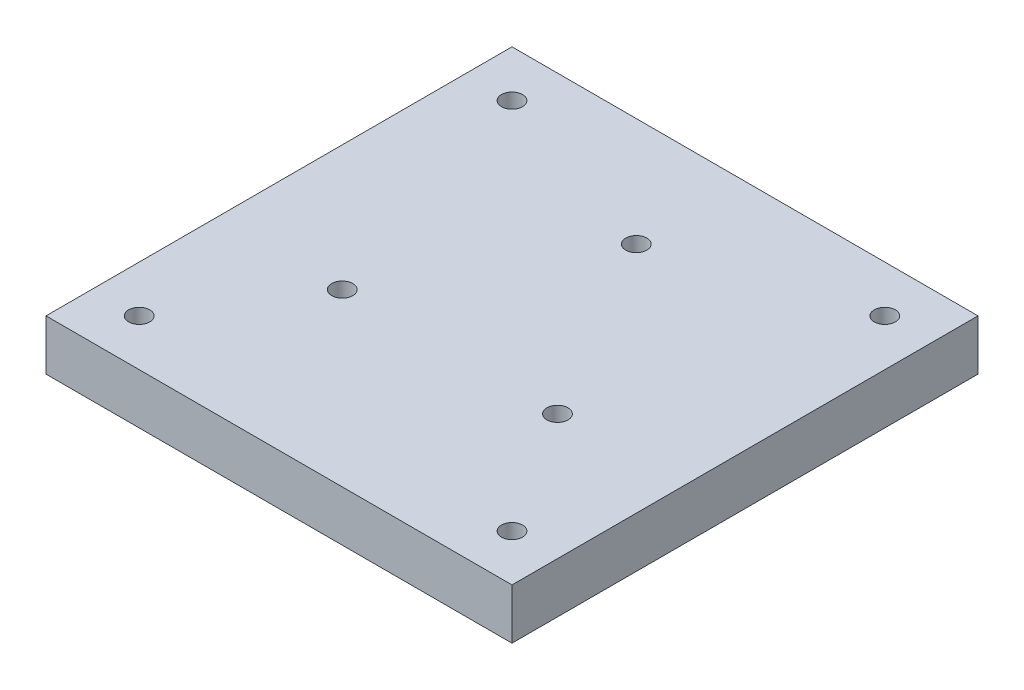
ISO-10303-21;
HEADER;
FILE_DESCRIPTION(('STEP AP214'),'2;1');
FILE_NAME('part.step','',(''),(''),'','','');
FILE_SCHEMA(('AUTOMOTIVE_DESIGN { 1 0 10303 214 1 1 1 1 }'));
ENDSEC;
DATA;
#1=APPLICATION_CONTEXT('core data for automotive mechanical design processes');
#2=APPLICATION_PROTOCOL_DEFINITION('international standard','automotive_design',2000,#1);
#3=PRODUCT_CONTEXT('',#1,'mechanical');
#4=PRODUCT('Part','Part','',(#3));
#5=PRODUCT_RELATED_PRODUCT_CATEGORY('part','',(#4));
#6=PRODUCT_DEFINITION_FORMATION('','',#4);
#7=PRODUCT_DEFINITION_CONTEXT('part definition',#1,'design');
#8=PRODUCT_DEFINITION('design','',#6,#7);
#9=PRODUCT_DEFINITION_SHAPE('','',#8);
#10=(LENGTH_UNIT() NAMED_UNIT(*) SI_UNIT(.MILLI.,.METRE.));
#11=(NAMED_UNIT(*) PLANE_ANGLE_UNIT() SI_UNIT($,.RADIAN.));
#12=(NAMED_UNIT(*) SI_UNIT($,.STERADIAN.) SOLID_ANGLE_UNIT());
#13=UNCERTAINTY_MEASURE_WITH_UNIT(LENGTH_MEASURE(1.E-05),#10,'distance_accuracy_value','');
#14=(GEOMETRIC_REPRESENTATION_CONTEXT(3) GLOBAL_UNCERTAINTY_ASSIGNED_CONTEXT((#13)) GLOBAL_UNIT_ASSIGNED_CONTEXT((#10,
#11,#12)) REPRESENTATION_CONTEXT('',''));
#15=CARTESIAN_POINT('',(0.,0.,0.));
#16=DIRECTION('',(0.,0.,1.));
#17=DIRECTION('',(1.,0.,0.));
#18=AXIS2_PLACEMENT_3D('',#15,#16,#17);
#19=CARTESIAN_POINT('',(0.,5.159375,0.));
#20=DIRECTION('',(0.,1.,0.));
#21=DIRECTION('',(0.,0.,1.));
#22=AXIS2_PLACEMENT_3D('',#19,#20,#21);
#23=PLANE('',#22);
#24=CARTESIAN_POINT('',(-38.1,5.159375,-38.1));
#25=DIRECTION('',(0.,-1.,0.));
#26=DIRECTION('',(0.,0.,-1.));
#27=AXIS2_PLACEMENT_3D('',#24,#25,#26);
#28=CIRCLE('',#27,2.15265);
#29=CARTESIAN_POINT('',(-38.1,5.159375,-40.25265));
#30=VERTEX_POINT('',#29);
#31=EDGE_CURVE('E245',#30,#30,#28,.T.);
#32=ORIENTED_EDGE('',*,*,#31,.T.);
#33=EDGE_LOOP('',(#32));
#34=FACE_BOUND('',#33,.T.);
#35=CARTESIAN_POINT('',(38.1,5.159375,38.1));
#36=DIRECTION('',(0.,-1.,0.));
#37=DIRECTION('',(0.,0.,-1.));
#38=AXIS2_PLACEMENT_3D('',#35,#36,#37);
#39=CIRCLE('',#38,2.15265);
#40=CARTESIAN_POINT('',(38.1,5.159375,35.94735));
#41=VERTEX_POINT('',#40);
#42=EDGE_CURVE('E231',#41,#41,#39,.T.);
#43=ORIENTED_EDGE('',*,*,#42,.T.);
#44=EDGE_LOOP('',(#43));
#45=FACE_BOUND('',#44,.T.);
#46=CARTESIAN_POINT('',(38.1,5.159375,-38.1));
#47=DIRECTION('',(0.,-1.,0.));
#48=DIRECTION('',(0.,0.,-1.));
#49=AXIS2_PLACEMENT_3D('',#46,#47,#48);
#50=CIRCLE('',#49,2.15265);
#51=CARTESIAN_POINT('',(38.1,5.159375,-40.25265));
#52=VERTEX_POINT('',#51);
#53=EDGE_CURVE('E214',#52,#52,#50,.T.);
#54=ORIENTED_EDGE('',*,*,#53,.T.);
#55=EDGE_LOOP('',(#54));
#56=FACE_BOUND('',#55,.T.);
#57=CARTESIAN_POINT('',(-38.1,5.159375,38.1));
#58=DIRECTION('',(0.,-1.,0.));
#59=DIRECTION('',(0.,0.,-1.));
#60=AXIS2_PLACEMENT_3D('',#57,#58,#59);
#61=CIRCLE('',#60,2.15265);
#62=CARTESIAN_POINT('',(-38.1,5.159375,35.94735));
#63=VERTEX_POINT('',#62);
#64=EDGE_CURVE('E188',#63,#63,#61,.T.);
#65=ORIENTED_EDGE('',*,*,#64,.T.);
#66=EDGE_LOOP('',(#65));
#67=FACE_BOUND('',#66,.T.);
#68=CARTESIAN_POINT('',(-21.9970452561247,5.159375,12.7000000000001));
#69=DIRECTION('',(0.,-1.,0.));
#70=DIRECTION('',(0.,0.,-1.));
#71=AXIS2_PLACEMENT_3D('',#68,#69,#70);
#72=CIRCLE('',#71,2.15265);
#73=CARTESIAN_POINT('',(-21.9970452561247,5.159375,10.5473500000001));
#74=VERTEX_POINT('',#73);
#75=EDGE_CURVE('E172',#74,#74,#72,.T.);
#76=ORIENTED_EDGE('',*,*,#75,.T.);
#77=EDGE_LOOP('',(#76));
#78=FACE_BOUND('',#77,.T.);
#79=CARTESIAN_POINT('',(21.9970452561249,5.159375,12.6999999999998));
#80=DIRECTION('',(0.,-1.,0.));
#81=DIRECTION('',(0.,0.,-1.));
#82=AXIS2_PLACEMENT_3D('',#79,#80,#81);
#83=CIRCLE('',#82,2.15265);
#84=CARTESIAN_POINT('',(21.9970452561249,5.159375,10.5473499999998));
#85=VERTEX_POINT('',#84);
#86=EDGE_CURVE('E156',#85,#85,#83,.T.);
#87=ORIENTED_EDGE('',*,*,#86,.T.);
#88=EDGE_LOOP('',(#87));
#89=FACE_BOUND('',#88,.T.);
#90=CARTESIAN_POINT('',(0.,5.159375,-25.4));
#91=DIRECTION('',(0.,-1.,0.));
#92=DIRECTION('',(0.,0.,-1.));
#93=AXIS2_PLACEMENT_3D('',#90,#91,#92);
#94=CIRCLE('',#93,2.15265);
#95=CARTESIAN_POINT('',(0.,5.159375,-27.55265));
#96=VERTEX_POINT('',#95);
#97=EDGE_CURVE('E123',#96,#96,#94,.T.);
#98=ORIENTED_EDGE('',*,*,#97,.T.);
#99=EDGE_LOOP('',(#98));
#100=FACE_BOUND('',#99,.T.);
#101=DIRECTION('',(1.,0.,0.));
#102=VECTOR('',#101,1.);
#103=CARTESIAN_POINT('',(-47.625,5.159375,47.625));
#104=LINE('',#103,#102);
#105=CARTESIAN_POINT('',(-47.625,5.159375,47.625));
#106=VERTEX_POINT('',#105);
#107=CARTESIAN_POINT('',(47.625,5.159375,47.625));
#108=VERTEX_POINT('',#107);
#109=EDGE_CURVE('E99',#106,#108,#104,.T.);
#110=ORIENTED_EDGE('',*,*,#109,.T.);
#111=DIRECTION('',(0.,0.,-1.));
#112=VECTOR('',#111,1.);
#113=CARTESIAN_POINT('',(47.625,5.159375,47.625));
#114=LINE('',#113,#112);
#115=CARTESIAN_POINT('',(47.625,5.159375,-47.625));
#116=VERTEX_POINT('',#115);
#117=EDGE_CURVE('E118',#108,#116,#114,.T.);
#118=ORIENTED_EDGE('',*,*,#117,.T.);
#119=DIRECTION('',(-1.,0.,0.));
#120=VECTOR('',#119,1.);
#121=CARTESIAN_POINT('',(-47.625,5.159375,-47.625));
#122=LINE('',#121,#120);
#123=CARTESIAN_POINT('',(-47.625,5.159375,-47.625));
#124=VERTEX_POINT('',#123);
#125=EDGE_CURVE('E122',#116,#124,#122,.T.);
#126=ORIENTED_EDGE('',*,*,#125,.T.);
#127=DIRECTION('',(0.,0.,1.));
#128=VECTOR('',#127,1.);
#129=CARTESIAN_POINT('',(-47.625,5.159375,47.625));
#130=LINE('',#129,#128);
#131=EDGE_CURVE('E77',#124,#106,#130,.T.);
#132=ORIENTED_EDGE('',*,*,#131,.T.);
#133=EDGE_LOOP('',(#110,#118,#126,#132));
#134=FACE_BOUND('',#133,.T.);
#135=ADVANCED_FACE('F52',(#34,#45,#56,#67,#78,#89,#100,#134),#23,.T.);
#136=CARTESIAN_POINT('',(47.625,-5.159375,47.625));
#137=DIRECTION('',(1.,0.,0.));
#138=DIRECTION('',(0.,0.,-1.));
#139=AXIS2_PLACEMENT_3D('',#136,#137,#138);
#140=PLANE('',#139);
#141=ORIENTED_EDGE('',*,*,#117,.F.);
#142=DIRECTION('',(0.,1.,0.));
#143=VECTOR('',#142,1.);
#144=CARTESIAN_POINT('',(47.625,-5.159375,47.625));
#145=LINE('',#144,#143);
#146=CARTESIAN_POINT('',(47.625,-5.159375,47.625));
#147=VERTEX_POINT('',#146);
#148=EDGE_CURVE('E12',#147,#108,#145,.T.);
#149=ORIENTED_EDGE('',*,*,#148,.F.);
#150=DIRECTION('',(0.,0.,-1.));
#151=VECTOR('',#150,1.);
#152=CARTESIAN_POINT('',(47.625,-5.159375,47.625));
#153=LINE('',#152,#151);
#154=CARTESIAN_POINT('',(47.625,-5.159375,-47.625));
#155=VERTEX_POINT('',#154);
#156=EDGE_CURVE('E69',#147,#155,#153,.T.);
#157=ORIENTED_EDGE('',*,*,#156,.T.);
#158=DIRECTION('',(0.,1.,0.));
#159=VECTOR('',#158,1.);
#160=CARTESIAN_POINT('',(47.625,-5.159375,-47.625));
#161=LINE('',#160,#159);
#162=EDGE_CURVE('E55',#155,#116,#161,.T.);
#163=ORIENTED_EDGE('',*,*,#162,.T.);
#164=EDGE_LOOP('',(#141,#149,#157,#163));
#165=FACE_BOUND('',#164,.T.);
#166=ADVANCED_FACE('F136',(#165),#140,.T.);
#167=CARTESIAN_POINT('',(-47.625,-5.159375,47.625));
#168=DIRECTION('',(0.,0.,1.));
#169=DIRECTION('',(1.,0.,0.));
#170=AXIS2_PLACEMENT_3D('',#167,#168,#169);
#171=PLANE('',#170);
#172=ORIENTED_EDGE('',*,*,#109,.F.);
#173=DIRECTION('',(0.,1.,0.));
#174=VECTOR('',#173,1.);
#175=CARTESIAN_POINT('',(-47.625,-5.159375,47.625));
#176=LINE('',#175,#174);
#177=CARTESIAN_POINT('',(-47.625,-5.159375,47.625));
#178=VERTEX_POINT('',#177);
#179=EDGE_CURVE('E61',#178,#106,#176,.T.);
#180=ORIENTED_EDGE('',*,*,#179,.F.);
#181=DIRECTION('',(1.,0.,0.));
#182=VECTOR('',#181,1.);
#183=CARTESIAN_POINT('',(-47.625,-5.159375,47.625));
#184=LINE('',#183,#182);
#185=EDGE_CURVE('E97',#178,#147,#184,.T.);
#186=ORIENTED_EDGE('',*,*,#185,.T.);
#187=ORIENTED_EDGE('',*,*,#148,.T.);
#188=EDGE_LOOP('',(#172,#180,#186,#187));
#189=FACE_BOUND('',#188,.T.);
#190=ADVANCED_FACE('F95',(#189),#171,.T.);
#191=CARTESIAN_POINT('',(-47.625,-5.159375,47.625));
#192=DIRECTION('',(-1.,0.,0.));
#193=DIRECTION('',(0.,0.,1.));
#194=AXIS2_PLACEMENT_3D('',#191,#192,#193);
#195=PLANE('',#194);
#196=ORIENTED_EDGE('',*,*,#131,.F.);
#197=DIRECTION('',(0.,1.,0.));
#198=VECTOR('',#197,1.);
#199=CARTESIAN_POINT('',(-47.625,-5.159375,-47.625));
#200=LINE('',#199,#198);
#201=CARTESIAN_POINT('',(-47.625,-5.159375,-47.625));
#202=VERTEX_POINT('',#201);
#203=EDGE_CURVE('E101',#202,#124,#200,.T.);
#204=ORIENTED_EDGE('',*,*,#203,.F.);
#205=DIRECTION('',(0.,0.,1.));
#206=VECTOR('',#205,1.);
#207=CARTESIAN_POINT('',(-47.625,-5.159375,47.625));
#208=LINE('',#207,#206);
#209=EDGE_CURVE('E104',#202,#178,#208,.T.);
#210=ORIENTED_EDGE('',*,*,#209,.T.);
#211=ORIENTED_EDGE('',*,*,#179,.T.);
#212=EDGE_LOOP('',(#196,#204,#210,#211));
#213=FACE_BOUND('',#212,.T.);
#214=ADVANCED_FACE('F105',(#213),#195,.T.);
#215=CARTESIAN_POINT('',(-47.625,-5.159375,-47.625));
#216=DIRECTION('',(0.,0.,-1.));
#217=DIRECTION('',(-1.,0.,0.));
#218=AXIS2_PLACEMENT_3D('',#215,#216,#217);
#219=PLANE('',#218);
#220=ORIENTED_EDGE('',*,*,#125,.F.);
#221=ORIENTED_EDGE('',*,*,#162,.F.);
#222=DIRECTION('',(-1.,0.,0.));
#223=VECTOR('',#222,1.);
#224=CARTESIAN_POINT('',(-47.625,-5.159375,-47.625));
#225=LINE('',#224,#223);
#226=EDGE_CURVE('E110',#155,#202,#225,.T.);
#227=ORIENTED_EDGE('',*,*,#226,.T.);
#228=ORIENTED_EDGE('',*,*,#203,.T.);
#229=EDGE_LOOP('',(#220,#221,#227,#228));
#230=FACE_BOUND('',#229,.T.);
#231=ADVANCED_FACE('F133',(#230),#219,.T.);
#232=CARTESIAN_POINT('',(0.,-5.159375,0.));
#233=DIRECTION('',(0.,-1.,0.));
#234=DIRECTION('',(0.,0.,-1.));
#235=AXIS2_PLACEMENT_3D('',#232,#233,#234);
#236=PLANE('',#235);
#237=CARTESIAN_POINT('',(-38.1,-5.159375,-38.1));
#238=DIRECTION('',(0.,-1.,0.));
#239=DIRECTION('',(0.,0.,-1.));
#240=AXIS2_PLACEMENT_3D('',#237,#238,#239);
#241=CIRCLE('',#240,3.96875);
#242=CARTESIAN_POINT('',(-38.1,-5.159375,-42.06875));
#243=VERTEX_POINT('',#242);
#244=EDGE_CURVE('E226',#243,#243,#241,.T.);
#245=ORIENTED_EDGE('',*,*,#244,.F.);
#246=EDGE_LOOP('',(#245));
#247=FACE_BOUND('',#246,.T.);
#248=CARTESIAN_POINT('',(38.1,-5.159375,38.1));
#249=DIRECTION('',(0.,-1.,0.));
#250=DIRECTION('',(0.,0.,-1.));
#251=AXIS2_PLACEMENT_3D('',#248,#249,#250);
#252=CIRCLE('',#251,3.96875);
#253=CARTESIAN_POINT('',(38.1,-5.159375,34.13125));
#254=VERTEX_POINT('',#253);
#255=EDGE_CURVE('E209',#254,#254,#252,.T.);
#256=ORIENTED_EDGE('',*,*,#255,.F.);
#257=EDGE_LOOP('',(#256));
#258=FACE_BOUND('',#257,.T.);
#259=CARTESIAN_POINT('',(38.1,-5.159375,-38.1));
#260=DIRECTION('',(0.,-1.,0.));
#261=DIRECTION('',(0.,0.,-1.));
#262=AXIS2_PLACEMENT_3D('',#259,#260,#261);
#263=CIRCLE('',#262,3.96875);
#264=CARTESIAN_POINT('',(38.1,-5.159375,-42.06875));
#265=VERTEX_POINT('',#264);
#266=EDGE_CURVE('E218',#265,#265,#263,.T.);
#267=ORIENTED_EDGE('',*,*,#266,.F.);
#268=EDGE_LOOP('',(#267));
#269=FACE_BOUND('',#268,.T.);
#270=CARTESIAN_POINT('',(-38.1,-5.159375,38.1));
#271=DIRECTION('',(0.,-1.,0.));
#272=DIRECTION('',(0.,0.,-1.));
#273=AXIS2_PLACEMENT_3D('',#270,#271,#272);
#274=CIRCLE('',#273,3.96875);
#275=CARTESIAN_POINT('',(-38.1,-5.159375,34.13125));
#276=VERTEX_POINT('',#275);
#277=EDGE_CURVE('E200',#276,#276,#274,.T.);
#278=ORIENTED_EDGE('',*,*,#277,.F.);
#279=EDGE_LOOP('',(#278));
#280=FACE_BOUND('',#279,.T.);
#281=CARTESIAN_POINT('',(-21.9970452561247,-5.159375,12.7000000000001));
#282=DIRECTION('',(0.,-1.,0.));
#283=DIRECTION('',(0.,0.,-1.));
#284=AXIS2_PLACEMENT_3D('',#281,#282,#283);
#285=CIRCLE('',#284,3.96875);
#286=CARTESIAN_POINT('',(-21.9970452561247,-5.159375,8.7312500000001));
#287=VERTEX_POINT('',#286);
#288=EDGE_CURVE('E184',#287,#287,#285,.T.);
#289=ORIENTED_EDGE('',*,*,#288,.F.);
#290=EDGE_LOOP('',(#289));
#291=FACE_BOUND('',#290,.T.);
#292=CARTESIAN_POINT('',(21.9970452561249,-5.159375,12.6999999999998));
#293=DIRECTION('',(0.,-1.,0.));
#294=DIRECTION('',(0.,0.,-1.));
#295=AXIS2_PLACEMENT_3D('',#292,#293,#294);
#296=CIRCLE('',#295,3.96875);
#297=CARTESIAN_POINT('',(21.9970452561249,-5.159375,8.7312499999998));
#298=VERTEX_POINT('',#297);
#299=EDGE_CURVE('E168',#298,#298,#296,.T.);
#300=ORIENTED_EDGE('',*,*,#299,.F.);
#301=EDGE_LOOP('',(#300));
#302=FACE_BOUND('',#301,.T.);
#303=CARTESIAN_POINT('',(0.,-5.159375,-25.4));
#304=DIRECTION('',(0.,-1.,0.));
#305=DIRECTION('',(0.,0.,-1.));
#306=AXIS2_PLACEMENT_3D('',#303,#304,#305);
#307=CIRCLE('',#306,3.96875);
#308=CARTESIAN_POINT('',(0.,-5.159375,-29.36875));
#309=VERTEX_POINT('',#308);
#310=EDGE_CURVE('E152',#309,#309,#307,.T.);
#311=ORIENTED_EDGE('',*,*,#310,.F.);
#312=EDGE_LOOP('',(#311));
#313=FACE_BOUND('',#312,.T.);
#314=ORIENTED_EDGE('',*,*,#226,.F.);
#315=ORIENTED_EDGE('',*,*,#156,.F.);
#316=ORIENTED_EDGE('',*,*,#185,.F.);
#317=ORIENTED_EDGE('',*,*,#209,.F.);
#318=EDGE_LOOP('',(#314,#315,#316,#317));
#319=FACE_BOUND('',#318,.T.);
#320=ADVANCED_FACE('F112',(#247,#258,#269,#280,#291,#302,#313,#319),#236,.T.);
#321=CARTESIAN_POINT('',(0.,-5.159375,-25.4));
#322=DIRECTION('',(0.,-1.,0.));
#323=DIRECTION('',(0.,0.,-1.));
#324=AXIS2_PLACEMENT_3D('',#321,#322,#323);
#325=CYLINDRICAL_SURFACE('',#324,2.15265);
#326=ORIENTED_EDGE('',*,*,#97,.F.);
#327=EDGE_LOOP('',(#326));
#328=FACE_BOUND('',#327,.T.);
#329=CARTESIAN_POINT('',(0.,0.225424999999999,-25.4));
#330=DIRECTION('',(0.,-1.,0.));
#331=DIRECTION('',(0.,0.,-1.));
#332=AXIS2_PLACEMENT_3D('',#329,#330,#331);
#333=CIRCLE('',#332,2.15265);
#334=CARTESIAN_POINT('',(0.,0.225424999999999,-27.55265));
#335=VERTEX_POINT('',#334);
#336=EDGE_CURVE('E144',#335,#335,#333,.T.);
#337=ORIENTED_EDGE('',*,*,#336,.T.);
#338=EDGE_LOOP('',(#337));
#339=FACE_BOUND('',#338,.T.);
#340=ADVANCED_FACE('F257',(#328,#339),#325,.F.);
#341=CARTESIAN_POINT('',(2.15265,0.225424999999999,-25.4));
#342=DIRECTION('',(0.,1.,0.));
#343=DIRECTION('',(0.,0.,1.));
#344=AXIS2_PLACEMENT_3D('',#341,#342,#343);
#345=PLANE('',#344);
#346=ORIENTED_EDGE('',*,*,#336,.F.);
#347=EDGE_LOOP('',(#346));
#348=FACE_BOUND('',#347,.T.);
#349=CARTESIAN_POINT('',(0.,0.225424999999999,-25.4));
#350=DIRECTION('',(0.,-1.,0.));
#351=DIRECTION('',(0.,0.,-1.));
#352=AXIS2_PLACEMENT_3D('',#349,#350,#351);
#353=CIRCLE('',#352,3.96875);
#354=CARTESIAN_POINT('',(0.,0.225424999999999,-29.36875));
#355=VERTEX_POINT('',#354);
#356=EDGE_CURVE('E148',#355,#355,#353,.T.);
#357=ORIENTED_EDGE('',*,*,#356,.T.);
#358=EDGE_LOOP('',(#357));
#359=FACE_BOUND('',#358,.T.);
#360=ADVANCED_FACE('F273',(#348,#359),#345,.F.);
#361=CARTESIAN_POINT('',(0.,-5.159375,-25.4));
#362=DIRECTION('',(0.,-1.,0.));
#363=DIRECTION('',(0.,0.,-1.));
#364=AXIS2_PLACEMENT_3D('',#361,#362,#363);
#365=CYLINDRICAL_SURFACE('',#364,3.96875);
#366=ORIENTED_EDGE('',*,*,#356,.F.);
#367=EDGE_LOOP('',(#366));
#368=FACE_BOUND('',#367,.T.);
#369=ORIENTED_EDGE('',*,*,#310,.T.);
#370=EDGE_LOOP('',(#369));
#371=FACE_BOUND('',#370,.T.);
#372=ADVANCED_FACE('F270',(#368,#371),#365,.F.);
#373=CARTESIAN_POINT('',(21.9970452561249,-5.159375,12.6999999999998));
#374=DIRECTION('',(0.,-1.,0.));
#375=DIRECTION('',(0.,0.,-1.));
#376=AXIS2_PLACEMENT_3D('',#373,#374,#375);
#377=CYLINDRICAL_SURFACE('',#376,2.15265);
#378=ORIENTED_EDGE('',*,*,#86,.F.);
#379=EDGE_LOOP('',(#378));
#380=FACE_BOUND('',#379,.T.);
#381=CARTESIAN_POINT('',(21.9970452561249,0.225424999999999,12.6999999999998));
#382=DIRECTION('',(0.,-1.,0.));
#383=DIRECTION('',(0.,0.,-1.));
#384=AXIS2_PLACEMENT_3D('',#381,#382,#383);
#385=CIRCLE('',#384,2.15265);
#386=CARTESIAN_POINT('',(21.9970452561249,0.225424999999999,10.5473499999998));
#387=VERTEX_POINT('',#386);
#388=EDGE_CURVE('E160',#387,#387,#385,.T.);
#389=ORIENTED_EDGE('',*,*,#388,.T.);
#390=EDGE_LOOP('',(#389));
#391=FACE_BOUND('',#390,.T.);
#392=ADVANCED_FACE('F272',(#380,#391),#377,.F.);
#393=CARTESIAN_POINT('',(24.1496952561249,0.225424999999999,12.6999999999998));
#394=DIRECTION('',(0.,1.,0.));
#395=DIRECTION('',(0.,0.,1.));
#396=AXIS2_PLACEMENT_3D('',#393,#394,#395);
#397=PLANE('',#396);
#398=ORIENTED_EDGE('',*,*,#388,.F.);
#399=EDGE_LOOP('',(#398));
#400=FACE_BOUND('',#399,.T.);
#401=CARTESIAN_POINT('',(21.9970452561249,0.225424999999999,12.6999999999998));
#402=DIRECTION('',(0.,-1.,0.));
#403=DIRECTION('',(0.,0.,-1.));
#404=AXIS2_PLACEMENT_3D('',#401,#402,#403);
#405=CIRCLE('',#404,3.96875);
#406=CARTESIAN_POINT('',(21.9970452561249,0.225424999999999,8.7312499999998));
#407=VERTEX_POINT('',#406);
#408=EDGE_CURVE('E164',#407,#407,#405,.T.);
#409=ORIENTED_EDGE('',*,*,#408,.T.);
#410=EDGE_LOOP('',(#409));
#411=FACE_BOUND('',#410,.T.);
#412=ADVANCED_FACE('F280',(#400,#411),#397,.F.);
#413=CARTESIAN_POINT('',(21.9970452561249,-5.159375,12.6999999999998));
#414=DIRECTION('',(0.,-1.,0.));
#415=DIRECTION('',(0.,0.,-1.));
#416=AXIS2_PLACEMENT_3D('',#413,#414,#415);
#417=CYLINDRICAL_SURFACE('',#416,3.96875);
#418=ORIENTED_EDGE('',*,*,#408,.F.);
#419=EDGE_LOOP('',(#418));
#420=FACE_BOUND('',#419,.T.);
#421=ORIENTED_EDGE('',*,*,#299,.T.);
#422=EDGE_LOOP('',(#421));
#423=FACE_BOUND('',#422,.T.);
#424=ADVANCED_FACE('F490',(#420,#423),#417,.F.);
#425=CARTESIAN_POINT('',(-21.9970452561247,-5.159375,12.7000000000001));
#426=DIRECTION('',(0.,-1.,0.));
#427=DIRECTION('',(0.,0.,-1.));
#428=AXIS2_PLACEMENT_3D('',#425,#426,#427);
#429=CYLINDRICAL_SURFACE('',#428,2.15265);
#430=ORIENTED_EDGE('',*,*,#75,.F.);
#431=EDGE_LOOP('',(#430));
#432=FACE_BOUND('',#431,.T.);
#433=CARTESIAN_POINT('',(-21.9970452561247,0.225424999999999,12.7000000000001));
#434=DIRECTION('',(0.,-1.,0.));
#435=DIRECTION('',(0.,0.,-1.));
#436=AXIS2_PLACEMENT_3D('',#433,#434,#435);
#437=CIRCLE('',#436,2.15265);
#438=CARTESIAN_POINT('',(-21.9970452561247,0.225424999999999,10.5473500000001));
#439=VERTEX_POINT('',#438);
#440=EDGE_CURVE('E176',#439,#439,#437,.T.);
#441=ORIENTED_EDGE('',*,*,#440,.T.);
#442=EDGE_LOOP('',(#441));
#443=FACE_BOUND('',#442,.T.);
#444=ADVANCED_FACE('F481',(#432,#443),#429,.F.);
#445=CARTESIAN_POINT('',(-19.8443952561247,0.225424999999999,12.7000000000001));
#446=DIRECTION('',(0.,1.,0.));
#447=DIRECTION('',(0.,0.,1.));
#448=AXIS2_PLACEMENT_3D('',#445,#446,#447);
#449=PLANE('',#448);
#450=ORIENTED_EDGE('',*,*,#440,.F.);
#451=EDGE_LOOP('',(#450));
#452=FACE_BOUND('',#451,.T.);
#453=CARTESIAN_POINT('',(-21.9970452561247,0.225424999999999,12.7000000000001));
#454=DIRECTION('',(0.,-1.,0.));
#455=DIRECTION('',(0.,0.,-1.));
#456=AXIS2_PLACEMENT_3D('',#453,#454,#455);
#457=CIRCLE('',#456,3.96875);
#458=CARTESIAN_POINT('',(-21.9970452561247,0.225424999999999,8.7312500000001));
#459=VERTEX_POINT('',#458);
#460=EDGE_CURVE('E180',#459,#459,#457,.T.);
#461=ORIENTED_EDGE('',*,*,#460,.T.);
#462=EDGE_LOOP('',(#461));
#463=FACE_BOUND('',#462,.T.);
#464=ADVANCED_FACE('F472',(#452,#463),#449,.F.);
#465=CARTESIAN_POINT('',(-21.9970452561247,-5.159375,12.7000000000001));
#466=DIRECTION('',(0.,-1.,0.));
#467=DIRECTION('',(0.,0.,-1.));
#468=AXIS2_PLACEMENT_3D('',#465,#466,#467);
#469=CYLINDRICAL_SURFACE('',#468,3.96875);
#470=ORIENTED_EDGE('',*,*,#460,.F.);
#471=EDGE_LOOP('',(#470));
#472=FACE_BOUND('',#471,.T.);
#473=ORIENTED_EDGE('',*,*,#288,.T.);
#474=EDGE_LOOP('',(#473));
#475=FACE_BOUND('',#474,.T.);
#476=ADVANCED_FACE('F463',(#472,#475),#469,.F.);
#477=CARTESIAN_POINT('',(-38.1,-5.159375,38.1));
#478=DIRECTION('',(0.,-1.,0.));
#479=DIRECTION('',(0.,0.,-1.));
#480=AXIS2_PLACEMENT_3D('',#477,#478,#479);
#481=CYLINDRICAL_SURFACE('',#480,2.15265);
#482=ORIENTED_EDGE('',*,*,#64,.F.);
#483=EDGE_LOOP('',(#482));
#484=FACE_BOUND('',#483,.T.);
#485=CARTESIAN_POINT('',(-38.1,0.225424999999999,38.1));
#486=DIRECTION('',(0.,-1.,0.));
#487=DIRECTION('',(0.,0.,-1.));
#488=AXIS2_PLACEMENT_3D('',#485,#486,#487);
#489=CIRCLE('',#488,2.15265);
#490=CARTESIAN_POINT('',(-38.1,0.225424999999999,35.94735));
#491=VERTEX_POINT('',#490);
#492=EDGE_CURVE('E192',#491,#491,#489,.T.);
#493=ORIENTED_EDGE('',*,*,#492,.T.);
#494=EDGE_LOOP('',(#493));
#495=FACE_BOUND('',#494,.T.);
#496=ADVANCED_FACE('F454',(#484,#495),#481,.F.);
#497=CARTESIAN_POINT('',(-35.94735,0.225424999999999,38.1));
#498=DIRECTION('',(0.,1.,0.));
#499=DIRECTION('',(0.,0.,1.));
#500=AXIS2_PLACEMENT_3D('',#497,#498,#499);
#501=PLANE('',#500);
#502=ORIENTED_EDGE('',*,*,#492,.F.);
#503=EDGE_LOOP('',(#502));
#504=FACE_BOUND('',#503,.T.);
#505=CARTESIAN_POINT('',(-38.1,0.225424999999999,38.1));
#506=DIRECTION('',(0.,-1.,0.));
#507=DIRECTION('',(0.,0.,-1.));
#508=AXIS2_PLACEMENT_3D('',#505,#506,#507);
#509=CIRCLE('',#508,3.96875);
#510=CARTESIAN_POINT('',(-38.1,0.225424999999999,34.13125));
#511=VERTEX_POINT('',#510);
#512=EDGE_CURVE('E196',#511,#511,#509,.T.);
#513=ORIENTED_EDGE('',*,*,#512,.T.);
#514=EDGE_LOOP('',(#513));
#515=FACE_BOUND('',#514,.T.);
#516=ADVANCED_FACE('F445',(#504,#515),#501,.F.);
#517=CARTESIAN_POINT('',(-38.1,-5.159375,38.1));
#518=DIRECTION('',(0.,-1.,0.));
#519=DIRECTION('',(0.,0.,-1.));
#520=AXIS2_PLACEMENT_3D('',#517,#518,#519);
#521=CYLINDRICAL_SURFACE('',#520,3.96875);
#522=ORIENTED_EDGE('',*,*,#512,.F.);
#523=EDGE_LOOP('',(#522));
#524=FACE_BOUND('',#523,.T.);
#525=ORIENTED_EDGE('',*,*,#277,.T.);
#526=EDGE_LOOP('',(#525));
#527=FACE_BOUND('',#526,.T.);
#528=ADVANCED_FACE('F357',(#524,#527),#521,.F.);
#529=CARTESIAN_POINT('',(38.1,-5.159375,-38.1));
#530=DIRECTION('',(0.,-1.,0.));
#531=DIRECTION('',(0.,0.,-1.));
#532=AXIS2_PLACEMENT_3D('',#529,#530,#531);
#533=CYLINDRICAL_SURFACE('',#532,2.15265);
#534=ORIENTED_EDGE('',*,*,#53,.F.);
#535=EDGE_LOOP('',(#534));
#536=FACE_BOUND('',#535,.T.);
#537=CARTESIAN_POINT('',(38.1,0.225424999999999,-38.1));
#538=DIRECTION('',(0.,-1.,0.));
#539=DIRECTION('',(0.,0.,-1.));
#540=AXIS2_PLACEMENT_3D('',#537,#538,#539);
#541=CIRCLE('',#540,2.15265);
#542=CARTESIAN_POINT('',(38.1,0.225424999999999,-40.25265));
#543=VERTEX_POINT('',#542);
#544=EDGE_CURVE('E205',#543,#543,#541,.T.);
#545=ORIENTED_EDGE('',*,*,#544,.T.);
#546=EDGE_LOOP('',(#545));
#547=FACE_BOUND('',#546,.T.);
#548=ADVANCED_FACE('F352',(#536,#547),#533,.F.);
#549=CARTESIAN_POINT('',(40.25265,0.225424999999999,-38.1));
#550=DIRECTION('',(0.,1.,0.));
#551=DIRECTION('',(0.,0.,1.));
#552=AXIS2_PLACEMENT_3D('',#549,#550,#551);
#553=PLANE('',#552);
#554=ORIENTED_EDGE('',*,*,#544,.F.);
#555=EDGE_LOOP('',(#554));
#556=FACE_BOUND('',#555,.T.);
#557=CARTESIAN_POINT('',(38.1,0.225424999999999,-38.1));
#558=DIRECTION('',(0.,-1.,0.));
#559=DIRECTION('',(0.,0.,-1.));
#560=AXIS2_PLACEMENT_3D('',#557,#558,#559);
#561=CIRCLE('',#560,3.96875);
#562=CARTESIAN_POINT('',(38.1,0.225424999999999,-42.06875));
#563=VERTEX_POINT('',#562);
#564=EDGE_CURVE('E210',#563,#563,#561,.T.);
#565=ORIENTED_EDGE('',*,*,#564,.T.);
#566=EDGE_LOOP('',(#565));
#567=FACE_BOUND('',#566,.T.);
#568=ADVANCED_FACE('F356',(#556,#567),#553,.F.);
#569=CARTESIAN_POINT('',(38.1,-5.159375,-38.1));
#570=DIRECTION('',(0.,-1.,0.));
#571=DIRECTION('',(0.,0.,-1.));
#572=AXIS2_PLACEMENT_3D('',#569,#570,#571);
#573=CYLINDRICAL_SURFACE('',#572,3.96875);
#574=ORIENTED_EDGE('',*,*,#564,.F.);
#575=EDGE_LOOP('',(#574));
#576=FACE_BOUND('',#575,.T.);
#577=ORIENTED_EDGE('',*,*,#266,.T.);
#578=EDGE_LOOP('',(#577));
#579=FACE_BOUND('',#578,.T.);
#580=ADVANCED_FACE('F367',(#576,#579),#573,.F.);
#581=CARTESIAN_POINT('',(38.1,-5.159375,38.1));
#582=DIRECTION('',(0.,-1.,0.));
#583=DIRECTION('',(0.,0.,-1.));
#584=AXIS2_PLACEMENT_3D('',#581,#582,#583);
#585=CYLINDRICAL_SURFACE('',#584,2.15265);
#586=ORIENTED_EDGE('',*,*,#42,.F.);
#587=EDGE_LOOP('',(#586));
#588=FACE_BOUND('',#587,.T.);
#589=CARTESIAN_POINT('',(38.1,0.225424999999999,38.1));
#590=DIRECTION('',(0.,-1.,0.));
#591=DIRECTION('',(0.,0.,-1.));
#592=AXIS2_PLACEMENT_3D('',#589,#590,#591);
#593=CIRCLE('',#592,2.15265);
#594=CARTESIAN_POINT('',(38.1,0.225424999999999,35.94735));
#595=VERTEX_POINT('',#594);
#596=EDGE_CURVE('E222',#595,#595,#593,.T.);
#597=ORIENTED_EDGE('',*,*,#596,.T.);
#598=EDGE_LOOP('',(#597));
#599=FACE_BOUND('',#598,.T.);
#600=ADVANCED_FACE('F376',(#588,#599),#585,.F.);
#601=CARTESIAN_POINT('',(40.25265,0.225424999999999,38.1));
#602=DIRECTION('',(0.,1.,0.));
#603=DIRECTION('',(0.,0.,1.));
#604=AXIS2_PLACEMENT_3D('',#601,#602,#603);
#605=PLANE('',#604);
#606=ORIENTED_EDGE('',*,*,#596,.F.);
#607=EDGE_LOOP('',(#606));
#608=FACE_BOUND('',#607,.T.);
#609=CARTESIAN_POINT('',(38.1,0.225424999999999,38.1));
#610=DIRECTION('',(0.,-1.,0.));
#611=DIRECTION('',(0.,0.,-1.));
#612=AXIS2_PLACEMENT_3D('',#609,#610,#611);
#613=CIRCLE('',#612,3.96875);
#614=CARTESIAN_POINT('',(38.1,0.225424999999999,34.13125));
#615=VERTEX_POINT('',#614);
#616=EDGE_CURVE('E227',#615,#615,#613,.T.);
#617=ORIENTED_EDGE('',*,*,#616,.T.);
#618=EDGE_LOOP('',(#617));
#619=FACE_BOUND('',#618,.T.);
#620=ADVANCED_FACE('F385',(#608,#619),#605,.F.);
#621=CARTESIAN_POINT('',(38.1,-5.159375,38.1));
#622=DIRECTION('',(0.,-1.,0.));
#623=DIRECTION('',(0.,0.,-1.));
#624=AXIS2_PLACEMENT_3D('',#621,#622,#623);
#625=CYLINDRICAL_SURFACE('',#624,3.96875);
#626=ORIENTED_EDGE('',*,*,#616,.F.);
#627=EDGE_LOOP('',(#626));
#628=FACE_BOUND('',#627,.T.);
#629=ORIENTED_EDGE('',*,*,#255,.T.);
#630=EDGE_LOOP('',(#629));
#631=FACE_BOUND('',#630,.T.);
#632=ADVANCED_FACE('F394',(#628,#631),#625,.F.);
#633=CARTESIAN_POINT('',(-38.1,-5.159375,-38.1));
#634=DIRECTION('',(0.,-1.,0.));
#635=DIRECTION('',(0.,0.,-1.));
#636=AXIS2_PLACEMENT_3D('',#633,#634,#635);
#637=CYLINDRICAL_SURFACE('',#636,2.15265);
#638=ORIENTED_EDGE('',*,*,#31,.F.);
#639=EDGE_LOOP('',(#638));
#640=FACE_BOUND('',#639,.T.);
#641=CARTESIAN_POINT('',(-38.1,0.225424999999999,-38.1));
#642=DIRECTION('',(0.,-1.,0.));
#643=DIRECTION('',(0.,0.,-1.));
#644=AXIS2_PLACEMENT_3D('',#641,#642,#643);
#645=CIRCLE('',#644,2.15265);
#646=CARTESIAN_POINT('',(-38.1,0.225424999999999,-40.25265));
#647=VERTEX_POINT('',#646);
#648=EDGE_CURVE('E204',#647,#647,#645,.T.);
#649=ORIENTED_EDGE('',*,*,#648,.T.);
#650=EDGE_LOOP('',(#649));
#651=FACE_BOUND('',#650,.T.);
#652=ADVANCED_FACE('F403',(#640,#651),#637,.F.);
#653=CARTESIAN_POINT('',(-35.94735,0.225424999999999,-38.1));
#654=DIRECTION('',(0.,1.,0.));
#655=DIRECTION('',(0.,0.,1.));
#656=AXIS2_PLACEMENT_3D('',#653,#654,#655);
#657=PLANE('',#656);
#658=ORIENTED_EDGE('',*,*,#648,.F.);
#659=EDGE_LOOP('',(#658));
#660=FACE_BOUND('',#659,.T.);
#661=CARTESIAN_POINT('',(-38.1,0.225424999999999,-38.1));
#662=DIRECTION('',(0.,-1.,0.));
#663=DIRECTION('',(0.,0.,-1.));
#664=AXIS2_PLACEMENT_3D('',#661,#662,#663);
#665=CIRCLE('',#664,3.96875);
#666=CARTESIAN_POINT('',(-38.1,0.225424999999999,-42.06875));
#667=VERTEX_POINT('',#666);
#668=EDGE_CURVE('E241',#667,#667,#665,.T.);
#669=ORIENTED_EDGE('',*,*,#668,.T.);
#670=EDGE_LOOP('',(#669));
#671=FACE_BOUND('',#670,.T.);
#672=ADVANCED_FACE('F412',(#660,#671),#657,.F.);
#673=CARTESIAN_POINT('',(-38.1,-5.159375,-38.1));
#674=DIRECTION('',(0.,-1.,0.));
#675=DIRECTION('',(0.,0.,-1.));
#676=AXIS2_PLACEMENT_3D('',#673,#674,#675);
#677=CYLINDRICAL_SURFACE('',#676,3.96875);
#678=ORIENTED_EDGE('',*,*,#668,.F.);
#679=EDGE_LOOP('',(#678));
#680=FACE_BOUND('',#679,.T.);
#681=ORIENTED_EDGE('',*,*,#244,.T.);
#682=EDGE_LOOP('',(#681));
#683=FACE_BOUND('',#682,.T.);
#684=ADVANCED_FACE('F253',(#680,#683),#677,.F.);
#685=CLOSED_SHELL('',(#135,#166,#190,#214,#231,#320,#340,#360,#372,#392,#412,#424,#444,#464,
#476,#496,#516,#528,#548,#568,#580,#600,#620,#632,#652,#672,#684));
#686=MANIFOLD_SOLID_BREP('B2',#685);
#687=ADVANCED_BREP_SHAPE_REPRESENTATION('',(#18,#686),#14);
#688=SHAPE_DEFINITION_REPRESENTATION(#9,#687);
ENDSEC;
END-ISO-10303-21;
